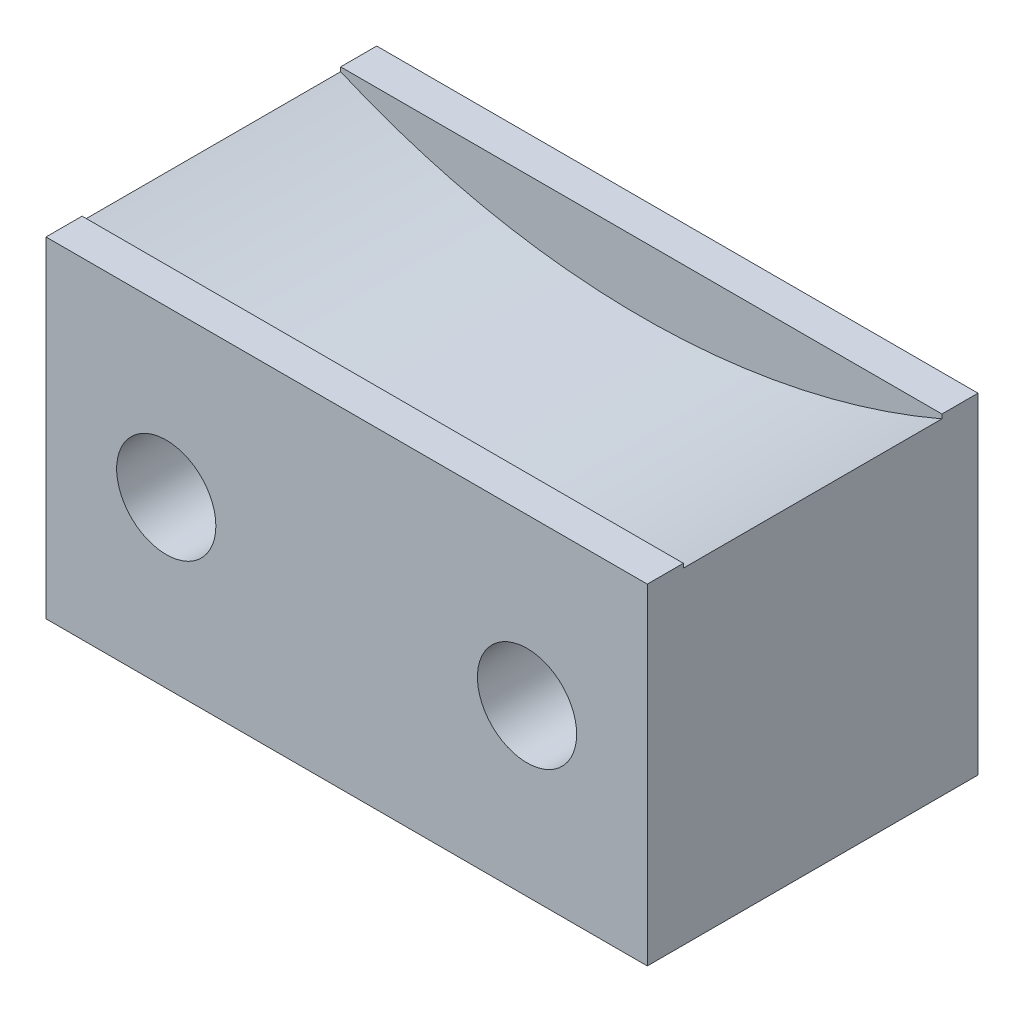
ISO-10303-21;
HEADER;
FILE_DESCRIPTION(('STEP AP214'),'2;1');
FILE_NAME('part.step','',(''),(''),'','','');
FILE_SCHEMA(('AUTOMOTIVE_DESIGN { 1 0 10303 214 1 1 1 1 }'));
ENDSEC;
DATA;
#1=APPLICATION_CONTEXT('core data for automotive mechanical design processes');
#2=APPLICATION_PROTOCOL_DEFINITION('international standard','automotive_design',2000,#1);
#3=PRODUCT_CONTEXT('',#1,'mechanical');
#4=PRODUCT('Part','Part','',(#3));
#5=PRODUCT_RELATED_PRODUCT_CATEGORY('part','',(#4));
#6=PRODUCT_DEFINITION_FORMATION('','',#4);
#7=PRODUCT_DEFINITION_CONTEXT('part definition',#1,'design');
#8=PRODUCT_DEFINITION('design','',#6,#7);
#9=PRODUCT_DEFINITION_SHAPE('','',#8);
#10=(LENGTH_UNIT() NAMED_UNIT(*) SI_UNIT(.MILLI.,.METRE.));
#11=(NAMED_UNIT(*) PLANE_ANGLE_UNIT() SI_UNIT($,.RADIAN.));
#12=(NAMED_UNIT(*) SI_UNIT($,.STERADIAN.) SOLID_ANGLE_UNIT());
#13=UNCERTAINTY_MEASURE_WITH_UNIT(LENGTH_MEASURE(1.E-05),#10,'distance_accuracy_value','');
#14=(GEOMETRIC_REPRESENTATION_CONTEXT(3) GLOBAL_UNCERTAINTY_ASSIGNED_CONTEXT((#13)) GLOBAL_UNIT_ASSIGNED_CONTEXT((#10,
#11,#12)) REPRESENTATION_CONTEXT('',''));
#15=CARTESIAN_POINT('',(0.,0.,0.));
#16=DIRECTION('',(0.,0.,1.));
#17=DIRECTION('',(1.,0.,0.));
#18=AXIS2_PLACEMENT_3D('',#15,#16,#17);
#19=CARTESIAN_POINT('',(-10.,-23.1,5.5));
#20=DIRECTION('',(0.,1.,0.));
#21=DIRECTION('',(0.,0.,1.));
#22=AXIS2_PLACEMENT_3D('',#19,#20,#21);
#23=PLANE('',#22);
#24=DIRECTION('',(-1.,0.,0.));
#25=VECTOR('',#24,1.);
#26=CARTESIAN_POINT('',(-10.,-23.1,-4.3));
#27=LINE('',#26,#25);
#28=CARTESIAN_POINT('',(10.,-23.1,-4.3));
#29=VERTEX_POINT('',#28);
#30=CARTESIAN_POINT('',(-10.,-23.1,-4.3));
#31=VERTEX_POINT('',#30);
#32=EDGE_CURVE('E108',#29,#31,#27,.T.);
#33=ORIENTED_EDGE('',*,*,#32,.F.);
#34=DIRECTION('',(0.,0.,1.));
#35=VECTOR('',#34,1.);
#36=CARTESIAN_POINT('',(10.,-23.1,5.5));
#37=LINE('',#36,#35);
#38=CARTESIAN_POINT('',(10.,-23.1,-5.5));
#39=VERTEX_POINT('',#38);
#40=EDGE_CURVE('E145',#39,#29,#37,.T.);
#41=ORIENTED_EDGE('',*,*,#40,.F.);
#42=DIRECTION('',(1.,0.,0.));
#43=VECTOR('',#42,1.);
#44=CARTESIAN_POINT('',(-10.,-23.1,-5.5));
#45=LINE('',#44,#43);
#46=CARTESIAN_POINT('',(-10.,-23.1,-5.5));
#47=VERTEX_POINT('',#46);
#48=EDGE_CURVE('E163',#47,#39,#45,.T.);
#49=ORIENTED_EDGE('',*,*,#48,.F.);
#50=DIRECTION('',(0.,0.,1.));
#51=VECTOR('',#50,1.);
#52=CARTESIAN_POINT('',(-10.,-23.1,5.5));
#53=LINE('',#52,#51);
#54=EDGE_CURVE('E157',#47,#31,#53,.T.);
#55=ORIENTED_EDGE('',*,*,#54,.T.);
#56=EDGE_LOOP('',(#33,#41,#49,#55));
#57=FACE_BOUND('',#56,.T.);
#58=ADVANCED_FACE('F32',(#57),#23,.T.);
#59=CARTESIAN_POINT('',(-10.,-23.1,5.5));
#60=DIRECTION('',(0.,0.,1.));
#61=DIRECTION('',(0.,-1.,0.));
#62=AXIS2_PLACEMENT_3D('',#59,#60,#61);
#63=PLANE('',#62);
#64=CARTESIAN_POINT('',(-6.00000000000001,-28.6,5.5));
#65=DIRECTION('',(0.,0.,1.));
#66=DIRECTION('',(1.,0.,0.));
#67=AXIS2_PLACEMENT_3D('',#64,#65,#66);
#68=CIRCLE('',#67,1.64999999999999);
#69=CARTESIAN_POINT('',(-4.35000000000002,-28.6,5.5));
#70=VERTEX_POINT('',#69);
#71=EDGE_CURVE('E123',#70,#70,#68,.T.);
#72=ORIENTED_EDGE('',*,*,#71,.F.);
#73=EDGE_LOOP('',(#72));
#74=FACE_BOUND('',#73,.T.);
#75=CARTESIAN_POINT('',(6.00000000000001,-28.6,5.5));
#76=DIRECTION('',(0.,0.,1.));
#77=DIRECTION('',(1.,0.,0.));
#78=AXIS2_PLACEMENT_3D('',#75,#76,#77);
#79=CIRCLE('',#78,1.64999999999999);
#80=CARTESIAN_POINT('',(7.64999999999999,-28.6,5.5));
#81=VERTEX_POINT('',#80);
#82=EDGE_CURVE('E127',#81,#81,#79,.T.);
#83=ORIENTED_EDGE('',*,*,#82,.F.);
#84=EDGE_LOOP('',(#83));
#85=FACE_BOUND('',#84,.T.);
#86=DIRECTION('',(1.,0.,0.));
#87=VECTOR('',#86,1.);
#88=CARTESIAN_POINT('',(-10.,-34.1,5.5));
#89=LINE('',#88,#87);
#90=CARTESIAN_POINT('',(-10.,-34.1,5.5));
#91=VERTEX_POINT('',#90);
#92=CARTESIAN_POINT('',(10.,-34.1,5.5));
#93=VERTEX_POINT('',#92);
#94=EDGE_CURVE('E160',#91,#93,#89,.T.);
#95=ORIENTED_EDGE('',*,*,#94,.T.);
#96=DIRECTION('',(0.,-1.,0.));
#97=VECTOR('',#96,1.);
#98=CARTESIAN_POINT('',(10.,-23.1,5.5));
#99=LINE('',#98,#97);
#100=CARTESIAN_POINT('',(10.,-23.1,5.5));
#101=VERTEX_POINT('',#100);
#102=EDGE_CURVE('E133',#101,#93,#99,.T.);
#103=ORIENTED_EDGE('',*,*,#102,.F.);
#104=DIRECTION('',(1.,0.,0.));
#105=VECTOR('',#104,1.);
#106=CARTESIAN_POINT('',(-10.,-23.1,5.5));
#107=LINE('',#106,#105);
#108=CARTESIAN_POINT('',(-10.,-23.1,5.5));
#109=VERTEX_POINT('',#108);
#110=EDGE_CURVE('E161',#109,#101,#107,.T.);
#111=ORIENTED_EDGE('',*,*,#110,.F.);
#112=DIRECTION('',(0.,-1.,0.));
#113=VECTOR('',#112,1.);
#114=CARTESIAN_POINT('',(-10.,-23.1,5.5));
#115=LINE('',#114,#113);
#116=EDGE_CURVE('E148',#109,#91,#115,.T.);
#117=ORIENTED_EDGE('',*,*,#116,.T.);
#118=EDGE_LOOP('',(#95,#103,#111,#117));
#119=FACE_BOUND('',#118,.T.);
#120=ADVANCED_FACE('F34',(#74,#85,#119),#63,.T.);
#121=DIRECTION('',(1.,0.,0.));
#122=VECTOR('',#121,1.);
#123=CARTESIAN_POINT('',(-10.,-23.1,4.3));
#124=LINE('',#123,#122);
#125=CARTESIAN_POINT('',(-10.,-23.1,4.3));
#126=VERTEX_POINT('',#125);
#127=CARTESIAN_POINT('',(10.,-23.1,4.3));
#128=VERTEX_POINT('',#127);
#129=EDGE_CURVE('E47',#126,#128,#124,.T.);
#130=ORIENTED_EDGE('',*,*,#129,.F.);
#131=EDGE_CURVE('E54',#126,#109,#53,.T.);
#132=ORIENTED_EDGE('',*,*,#131,.T.);
#133=ORIENTED_EDGE('',*,*,#110,.T.);
#134=EDGE_CURVE('E144',#128,#101,#37,.T.);
#135=ORIENTED_EDGE('',*,*,#134,.F.);
#136=EDGE_LOOP('',(#130,#132,#133,#135));
#137=FACE_BOUND('',#136,.T.);
#138=ADVANCED_FACE('F187',(#137),#23,.T.);
#139=CARTESIAN_POINT('',(-10.,-23.1,-5.5));
#140=DIRECTION('',(0.,0.,-1.));
#141=DIRECTION('',(0.,1.,0.));
#142=AXIS2_PLACEMENT_3D('',#139,#140,#141);
#143=PLANE('',#142);
#144=CARTESIAN_POINT('',(-6.00000000000001,-28.6,-5.5));
#145=DIRECTION('',(0.,0.,1.));
#146=DIRECTION('',(1.,0.,0.));
#147=AXIS2_PLACEMENT_3D('',#144,#145,#146);
#148=CIRCLE('',#147,1.64999999999999);
#149=CARTESIAN_POINT('',(-4.35000000000002,-28.6,-5.5));
#150=VERTEX_POINT('',#149);
#151=EDGE_CURVE('E124',#150,#150,#148,.T.);
#152=ORIENTED_EDGE('',*,*,#151,.T.);
#153=EDGE_LOOP('',(#152));
#154=FACE_BOUND('',#153,.T.);
#155=CARTESIAN_POINT('',(6.00000000000001,-28.6,-5.5));
#156=DIRECTION('',(0.,0.,1.));
#157=DIRECTION('',(1.,0.,0.));
#158=AXIS2_PLACEMENT_3D('',#155,#156,#157);
#159=CIRCLE('',#158,1.64999999999999);
#160=CARTESIAN_POINT('',(7.64999999999999,-28.6,-5.5));
#161=VERTEX_POINT('',#160);
#162=EDGE_CURVE('E130',#161,#161,#159,.T.);
#163=ORIENTED_EDGE('',*,*,#162,.T.);
#164=EDGE_LOOP('',(#163));
#165=FACE_BOUND('',#164,.T.);
#166=ORIENTED_EDGE('',*,*,#48,.T.);
#167=DIRECTION('',(0.,1.,0.));
#168=VECTOR('',#167,1.);
#169=CARTESIAN_POINT('',(10.,-23.1,-5.5));
#170=LINE('',#169,#168);
#171=CARTESIAN_POINT('',(10.,-34.1,-5.5));
#172=VERTEX_POINT('',#171);
#173=EDGE_CURVE('E141',#172,#39,#170,.T.);
#174=ORIENTED_EDGE('',*,*,#173,.F.);
#175=DIRECTION('',(1.,0.,0.));
#176=VECTOR('',#175,1.);
#177=CARTESIAN_POINT('',(-10.,-34.1,-5.5));
#178=LINE('',#177,#176);
#179=CARTESIAN_POINT('',(-10.,-34.1,-5.5));
#180=VERTEX_POINT('',#179);
#181=EDGE_CURVE('E165',#180,#172,#178,.T.);
#182=ORIENTED_EDGE('',*,*,#181,.F.);
#183=DIRECTION('',(0.,1.,0.));
#184=VECTOR('',#183,1.);
#185=CARTESIAN_POINT('',(-10.,-23.1,-5.5));
#186=LINE('',#185,#184);
#187=EDGE_CURVE('E154',#180,#47,#186,.T.);
#188=ORIENTED_EDGE('',*,*,#187,.T.);
#189=EDGE_LOOP('',(#166,#174,#182,#188));
#190=FACE_BOUND('',#189,.T.);
#191=ADVANCED_FACE('F188',(#154,#165,#190),#143,.T.);
#192=CARTESIAN_POINT('',(-10.,-34.1,5.5));
#193=DIRECTION('',(0.,-1.,0.));
#194=DIRECTION('',(0.,0.,-1.));
#195=AXIS2_PLACEMENT_3D('',#192,#193,#194);
#196=PLANE('',#195);
#197=ORIENTED_EDGE('',*,*,#181,.T.);
#198=DIRECTION('',(0.,0.,-1.));
#199=VECTOR('',#198,1.);
#200=CARTESIAN_POINT('',(10.,-34.1,5.5));
#201=LINE('',#200,#199);
#202=EDGE_CURVE('E138',#93,#172,#201,.T.);
#203=ORIENTED_EDGE('',*,*,#202,.F.);
#204=ORIENTED_EDGE('',*,*,#94,.F.);
#205=DIRECTION('',(0.,0.,-1.));
#206=VECTOR('',#205,1.);
#207=CARTESIAN_POINT('',(-10.,-34.1,5.5));
#208=LINE('',#207,#206);
#209=EDGE_CURVE('E151',#91,#180,#208,.T.);
#210=ORIENTED_EDGE('',*,*,#209,.T.);
#211=EDGE_LOOP('',(#197,#203,#204,#210));
#212=FACE_BOUND('',#211,.T.);
#213=ADVANCED_FACE('F182',(#212),#196,.T.);
#214=CARTESIAN_POINT('',(-10.,0.,0.));
#215=DIRECTION('',(1.,0.,0.));
#216=DIRECTION('',(0.,0.,-1.));
#217=AXIS2_PLACEMENT_3D('',#214,#215,#216);
#218=PLANE('',#217);
#219=DIRECTION('',(0.,0.,1.));
#220=VECTOR('',#219,1.);
#221=CARTESIAN_POINT('',(-10.,-23.2398364882373,-76.1592062560789));
#222=LINE('',#221,#220);
#223=CARTESIAN_POINT('',(-10.,-23.2398364882373,4.3));
#224=VERTEX_POINT('',#223);
#225=CARTESIAN_POINT('',(-10.,-23.2398364882373,-4.3));
#226=VERTEX_POINT('',#225);
#227=EDGE_CURVE('E98',#224,#226,#222,.F.);
#228=ORIENTED_EDGE('',*,*,#227,.T.);
#229=DIRECTION('',(0.,1.,0.));
#230=VECTOR('',#229,1.);
#231=CARTESIAN_POINT('',(-10.,0.,-4.3));
#232=LINE('',#231,#230);
#233=EDGE_CURVE('E121',#226,#31,#232,.T.);
#234=ORIENTED_EDGE('',*,*,#233,.T.);
#235=ORIENTED_EDGE('',*,*,#54,.F.);
#236=ORIENTED_EDGE('',*,*,#187,.F.);
#237=ORIENTED_EDGE('',*,*,#209,.F.);
#238=ORIENTED_EDGE('',*,*,#116,.F.);
#239=ORIENTED_EDGE('',*,*,#131,.F.);
#240=DIRECTION('',(0.,-1.,0.));
#241=VECTOR('',#240,1.);
#242=CARTESIAN_POINT('',(-10.,0.,4.3));
#243=LINE('',#242,#241);
#244=EDGE_CURVE('E109',#126,#224,#243,.T.);
#245=ORIENTED_EDGE('',*,*,#244,.T.);
#246=EDGE_LOOP('',(#228,#234,#235,#236,#237,#238,#239,#245));
#247=FACE_BOUND('',#246,.T.);
#248=ADVANCED_FACE('F114',(#247),#218,.F.);
#249=CARTESIAN_POINT('',(10.,0.,0.));
#250=DIRECTION('',(1.,0.,0.));
#251=DIRECTION('',(0.,0.,-1.));
#252=AXIS2_PLACEMENT_3D('',#249,#250,#251);
#253=PLANE('',#252);
#254=DIRECTION('',(0.,1.,0.));
#255=VECTOR('',#254,1.);
#256=CARTESIAN_POINT('',(10.,0.,-4.3));
#257=LINE('',#256,#255);
#258=CARTESIAN_POINT('',(10.,-23.2398364882372,-4.3));
#259=VERTEX_POINT('',#258);
#260=EDGE_CURVE('E11',#259,#29,#257,.T.);
#261=ORIENTED_EDGE('',*,*,#260,.F.);
#262=DIRECTION('',(0.,0.,1.));
#263=VECTOR('',#262,1.);
#264=CARTESIAN_POINT('',(10.,-23.2398364882372,-76.1592062560789));
#265=LINE('',#264,#263);
#266=CARTESIAN_POINT('',(10.,-23.2398364882372,4.3));
#267=VERTEX_POINT('',#266);
#268=EDGE_CURVE('E40',#267,#259,#265,.F.);
#269=ORIENTED_EDGE('',*,*,#268,.F.);
#270=DIRECTION('',(0.,-1.,0.));
#271=VECTOR('',#270,1.);
#272=CARTESIAN_POINT('',(10.,0.,4.3));
#273=LINE('',#272,#271);
#274=EDGE_CURVE('E112',#128,#267,#273,.T.);
#275=ORIENTED_EDGE('',*,*,#274,.F.);
#276=ORIENTED_EDGE('',*,*,#134,.T.);
#277=ORIENTED_EDGE('',*,*,#102,.T.);
#278=ORIENTED_EDGE('',*,*,#202,.T.);
#279=ORIENTED_EDGE('',*,*,#173,.T.);
#280=ORIENTED_EDGE('',*,*,#40,.T.);
#281=EDGE_LOOP('',(#261,#269,#275,#276,#277,#278,#279,#280));
#282=FACE_BOUND('',#281,.T.);
#283=ADVANCED_FACE('F173',(#282),#253,.T.);
#284=CARTESIAN_POINT('',(6.00000000000001,-28.6,-5.5));
#285=DIRECTION('',(0.,0.,1.));
#286=DIRECTION('',(1.,0.,0.));
#287=AXIS2_PLACEMENT_3D('',#284,#285,#286);
#288=CYLINDRICAL_SURFACE('',#287,1.64999999999999);
#289=ORIENTED_EDGE('',*,*,#162,.F.);
#290=EDGE_LOOP('',(#289));
#291=FACE_BOUND('',#290,.T.);
#292=ORIENTED_EDGE('',*,*,#82,.T.);
#293=EDGE_LOOP('',(#292));
#294=FACE_BOUND('',#293,.T.);
#295=ADVANCED_FACE('F208',(#291,#294),#288,.F.);
#296=CARTESIAN_POINT('',(-6.00000000000001,-28.6,-5.5));
#297=DIRECTION('',(0.,0.,1.));
#298=DIRECTION('',(1.,0.,0.));
#299=AXIS2_PLACEMENT_3D('',#296,#297,#298);
#300=CYLINDRICAL_SURFACE('',#299,1.64999999999999);
#301=ORIENTED_EDGE('',*,*,#151,.F.);
#302=EDGE_LOOP('',(#301));
#303=FACE_BOUND('',#302,.T.);
#304=ORIENTED_EDGE('',*,*,#71,.T.);
#305=EDGE_LOOP('',(#304));
#306=FACE_BOUND('',#305,.T.);
#307=ADVANCED_FACE('F211',(#303,#306),#300,.F.);
#308=CARTESIAN_POINT('',(-10.2109499601331,-6.3036894682128,-4.3));
#309=DIRECTION('',(0.,0.,-1.));
#310=DIRECTION('',(0.5253074556844,-0.850912496677762,0.));
#311=AXIS2_PLACEMENT_3D('',#308,#309,#310);
#312=PLANE('',#311);
#313=CARTESIAN_POINT('',(-1.11022302462516E-13,0.,-4.3));
#314=DIRECTION('',(0.,0.,-1.));
#315=DIRECTION('',(-1.,0.,0.));
#316=AXIS2_PLACEMENT_3D('',#313,#314,#315);
#317=CIRCLE('',#316,25.3000000000001);
#318=EDGE_CURVE('E104',#226,#259,#317,.F.);
#319=ORIENTED_EDGE('',*,*,#318,.T.);
#320=ORIENTED_EDGE('',*,*,#260,.T.);
#321=ORIENTED_EDGE('',*,*,#32,.T.);
#322=ORIENTED_EDGE('',*,*,#233,.F.);
#323=EDGE_LOOP('',(#319,#320,#321,#322));
#324=FACE_BOUND('',#323,.T.);
#325=ADVANCED_FACE('F171',(#324),#312,.F.);
#326=CARTESIAN_POINT('',(-1.11022302462516E-13,0.,-76.1592062560789));
#327=DIRECTION('',(0.,0.,1.));
#328=DIRECTION('',(1.,0.,0.));
#329=AXIS2_PLACEMENT_3D('',#326,#327,#328);
#330=CYLINDRICAL_SURFACE('',#329,25.3000000000001);
#331=CARTESIAN_POINT('',(-1.11022302462516E-13,0.,4.3));
#332=DIRECTION('',(0.,0.,1.));
#333=DIRECTION('',(1.,0.,0.));
#334=AXIS2_PLACEMENT_3D('',#331,#332,#333);
#335=CIRCLE('',#334,25.3000000000001);
#336=EDGE_CURVE('E101',#224,#267,#335,.T.);
#337=ORIENTED_EDGE('',*,*,#336,.T.);
#338=ORIENTED_EDGE('',*,*,#268,.T.);
#339=ORIENTED_EDGE('',*,*,#318,.F.);
#340=ORIENTED_EDGE('',*,*,#227,.F.);
#341=EDGE_LOOP('',(#337,#338,#339,#340));
#342=FACE_BOUND('',#341,.T.);
#343=ADVANCED_FACE('F100',(#342),#330,.F.);
#344=CARTESIAN_POINT('',(-21.272812416944,-13.13268639211,4.3));
#345=DIRECTION('',(0.,0.,1.));
#346=DIRECTION('',(-0.5253074556844,0.850912496677762,0.));
#347=AXIS2_PLACEMENT_3D('',#344,#345,#346);
#348=PLANE('',#347);
#349=ORIENTED_EDGE('',*,*,#129,.T.);
#350=ORIENTED_EDGE('',*,*,#274,.T.);
#351=ORIENTED_EDGE('',*,*,#336,.F.);
#352=ORIENTED_EDGE('',*,*,#244,.F.);
#353=EDGE_LOOP('',(#349,#350,#351,#352));
#354=FACE_BOUND('',#353,.T.);
#355=ADVANCED_FACE('F111',(#354),#348,.F.);
#356=CLOSED_SHELL('',(#58,#120,#138,#191,#213,#248,#283,#295,#307,#325,#343,#355));
#357=MANIFOLD_SOLID_BREP('B2',#356);
#358=ADVANCED_BREP_SHAPE_REPRESENTATION('',(#18,#357),#14);
#359=SHAPE_DEFINITION_REPRESENTATION(#9,#358);
ENDSEC;
END-ISO-10303-21;
